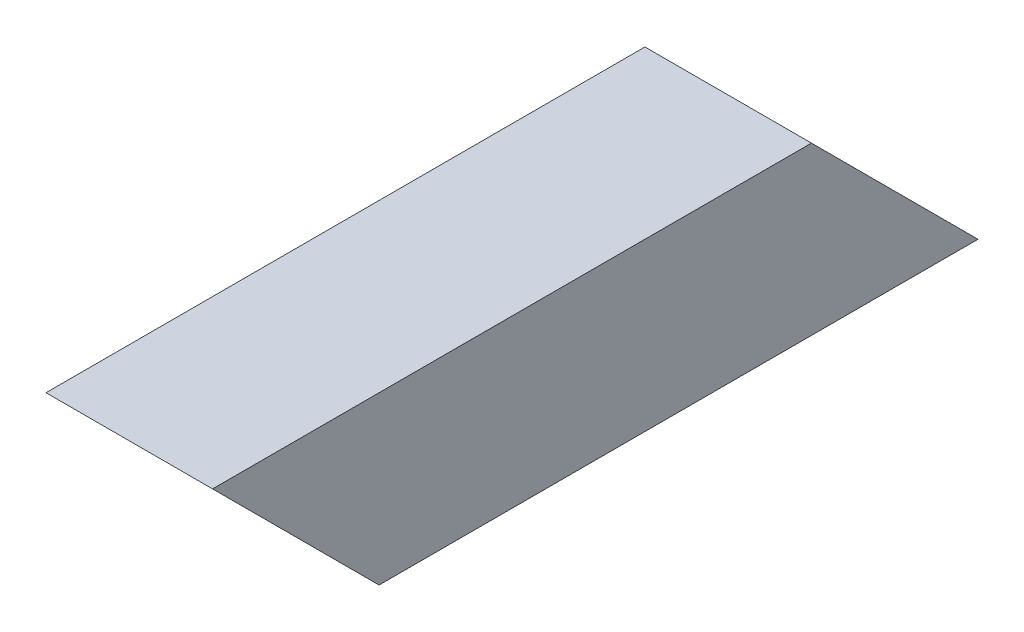
ISO-10303-21;
HEADER;
FILE_DESCRIPTION(('STEP AP214'),'2;1');
FILE_NAME('part.step','',(''),(''),'','','');
FILE_SCHEMA(('AUTOMOTIVE_DESIGN { 1 0 10303 214 1 1 1 1 }'));
ENDSEC;
DATA;
#1=APPLICATION_CONTEXT('core data for automotive mechanical design processes');
#2=APPLICATION_PROTOCOL_DEFINITION('international standard','automotive_design',2000,#1);
#3=PRODUCT_CONTEXT('',#1,'mechanical');
#4=PRODUCT('Part','Part','',(#3));
#5=PRODUCT_RELATED_PRODUCT_CATEGORY('part','',(#4));
#6=PRODUCT_DEFINITION_FORMATION('','',#4);
#7=PRODUCT_DEFINITION_CONTEXT('part definition',#1,'design');
#8=PRODUCT_DEFINITION('design','',#6,#7);
#9=PRODUCT_DEFINITION_SHAPE('','',#8);
#10=(LENGTH_UNIT() NAMED_UNIT(*) SI_UNIT(.MILLI.,.METRE.));
#11=(NAMED_UNIT(*) PLANE_ANGLE_UNIT() SI_UNIT($,.RADIAN.));
#12=(NAMED_UNIT(*) SI_UNIT($,.STERADIAN.) SOLID_ANGLE_UNIT());
#13=UNCERTAINTY_MEASURE_WITH_UNIT(LENGTH_MEASURE(1.E-05),#10,'distance_accuracy_value','');
#14=(GEOMETRIC_REPRESENTATION_CONTEXT(3) GLOBAL_UNCERTAINTY_ASSIGNED_CONTEXT((#13)) GLOBAL_UNIT_ASSIGNED_CONTEXT((#10,
#11,#12)) REPRESENTATION_CONTEXT('',''));
#15=CARTESIAN_POINT('',(0.,0.,0.));
#16=DIRECTION('',(0.,0.,1.));
#17=DIRECTION('',(1.,0.,0.));
#18=AXIS2_PLACEMENT_3D('',#15,#16,#17);
#19=CARTESIAN_POINT('',(-3.175,3.175,116.743329573834));
#20=DIRECTION('',(0.,1.,0.));
#21=DIRECTION('',(-1.,0.,0.));
#22=AXIS2_PLACEMENT_3D('',#19,#20,#21);
#23=PLANE('',#22);
#24=DIRECTION('',(-1.,0.,0.));
#25=VECTOR('',#24,1.);
#26=CARTESIAN_POINT('',(-3.175,3.175,94.5183295738334));
#27=LINE('',#26,#25);
#28=CARTESIAN_POINT('',(-3.175,3.175,94.5183295738334));
#29=VERTEX_POINT('',#28);
#30=CARTESIAN_POINT('',(-22.225,3.175,94.5183295738334));
#31=VERTEX_POINT('',#30);
#32=EDGE_CURVE('E11',#29,#31,#27,.T.);
#33=ORIENTED_EDGE('',*,*,#32,.F.);
#34=DIRECTION('',(0.,0.,-1.));
#35=VECTOR('',#34,1.);
#36=CARTESIAN_POINT('',(-3.175,3.175,116.743329573834));
#37=LINE('',#36,#35);
#38=CARTESIAN_POINT('',(-3.175,3.175,3.17500000000005));
#39=VERTEX_POINT('',#38);
#40=EDGE_CURVE('E154',#29,#39,#37,.T.);
#41=ORIENTED_EDGE('',*,*,#40,.T.);
#42=DIRECTION('',(1.,0.,0.));
#43=VECTOR('',#42,1.);
#44=CARTESIAN_POINT('',(-3.17499999999998,3.175,3.17500000000005));
#45=LINE('',#44,#43);
#46=CARTESIAN_POINT('',(-22.225,3.175,3.17500000000005));
#47=VERTEX_POINT('',#46);
#48=EDGE_CURVE('E48',#47,#39,#45,.T.);
#49=ORIENTED_EDGE('',*,*,#48,.F.);
#50=DIRECTION('',(0.,0.,-1.));
#51=VECTOR('',#50,1.);
#52=CARTESIAN_POINT('',(-22.225,3.175,116.743329573834));
#53=LINE('',#52,#51);
#54=EDGE_CURVE('E162',#31,#47,#53,.T.);
#55=ORIENTED_EDGE('',*,*,#54,.F.);
#56=EDGE_LOOP('',(#33,#41,#49,#55));
#57=FACE_BOUND('',#56,.T.);
#58=ADVANCED_FACE('F39',(#57),#23,.T.);
#59=CARTESIAN_POINT('',(-22.225,3.175,116.743329573834));
#60=DIRECTION('',(1.,0.,0.));
#61=DIRECTION('',(0.,1.,0.));
#62=AXIS2_PLACEMENT_3D('',#59,#60,#61);
#63=PLANE('',#62);
#64=DIRECTION('',(0.,0.707106781186539,0.707106781186556));
#65=VECTOR('',#64,1.);
#66=CARTESIAN_POINT('',(-22.225,14.2875000000003,105.630829573834));
#67=LINE('',#66,#65);
#68=CARTESIAN_POINT('',(-22.225,22.225,113.568329573834));
#69=VERTEX_POINT('',#68);
#70=EDGE_CURVE('E158',#31,#69,#67,.T.);
#71=ORIENTED_EDGE('',*,*,#70,.F.);
#72=ORIENTED_EDGE('',*,*,#54,.T.);
#73=DIRECTION('',(0.,-0.707106781186544,-0.707106781186551));
#74=VECTOR('',#73,1.);
#75=CARTESIAN_POINT('',(-22.225,59.959164786917,59.9591647869176));
#76=LINE('',#75,#74);
#77=CARTESIAN_POINT('',(-22.225,22.225,22.2250000000002));
#78=VERTEX_POINT('',#77);
#79=EDGE_CURVE('E145',#78,#47,#76,.T.);
#80=ORIENTED_EDGE('',*,*,#79,.F.);
#81=DIRECTION('',(0.,0.,-1.));
#82=VECTOR('',#81,1.);
#83=CARTESIAN_POINT('',(-22.225,22.225,116.743329573834));
#84=LINE('',#83,#82);
#85=EDGE_CURVE('E166',#69,#78,#84,.T.);
#86=ORIENTED_EDGE('',*,*,#85,.F.);
#87=EDGE_LOOP('',(#71,#72,#80,#86));
#88=FACE_BOUND('',#87,.T.);
#89=ADVANCED_FACE('F209',(#88),#63,.T.);
#90=CARTESIAN_POINT('',(-3.175,22.225,116.743329573834));
#91=DIRECTION('',(0.,-1.,0.));
#92=DIRECTION('',(1.,0.,0.));
#93=AXIS2_PLACEMENT_3D('',#90,#91,#92);
#94=PLANE('',#93);
#95=DIRECTION('',(1.,0.,0.));
#96=VECTOR('',#95,1.);
#97=CARTESIAN_POINT('',(-3.175,22.225,113.568329573834));
#98=LINE('',#97,#96);
#99=CARTESIAN_POINT('',(-3.175,22.225,113.568329573834));
#100=VERTEX_POINT('',#99);
#101=EDGE_CURVE('E168',#69,#100,#98,.T.);
#102=ORIENTED_EDGE('',*,*,#101,.F.);
#103=ORIENTED_EDGE('',*,*,#85,.T.);
#104=DIRECTION('',(-1.,0.,0.));
#105=VECTOR('',#104,1.);
#106=CARTESIAN_POINT('',(-3.17499999999998,22.225,22.2250000000002));
#107=LINE('',#106,#105);
#108=CARTESIAN_POINT('',(-3.175,22.225,22.2250000000002));
#109=VERTEX_POINT('',#108);
#110=EDGE_CURVE('E159',#109,#78,#107,.T.);
#111=ORIENTED_EDGE('',*,*,#110,.F.);
#112=DIRECTION('',(0.,0.,-1.));
#113=VECTOR('',#112,1.);
#114=CARTESIAN_POINT('',(-3.175,22.225,116.743329573834));
#115=LINE('',#114,#113);
#116=EDGE_CURVE('E156',#100,#109,#115,.T.);
#117=ORIENTED_EDGE('',*,*,#116,.F.);
#118=EDGE_LOOP('',(#102,#103,#111,#117));
#119=FACE_BOUND('',#118,.T.);
#120=ADVANCED_FACE('F207',(#119),#94,.T.);
#121=CARTESIAN_POINT('',(-3.175,3.175,116.743329573834));
#122=DIRECTION('',(-1.,0.,0.));
#123=DIRECTION('',(0.,-1.,0.));
#124=AXIS2_PLACEMENT_3D('',#121,#122,#123);
#125=PLANE('',#124);
#126=DIRECTION('',(0.,-0.707106781186539,-0.707106781186556));
#127=VECTOR('',#126,1.);
#128=CARTESIAN_POINT('',(-3.175,14.2875000000003,105.630829573834));
#129=LINE('',#128,#127);
#130=EDGE_CURVE('E62',#100,#29,#129,.T.);
#131=ORIENTED_EDGE('',*,*,#130,.F.);
#132=ORIENTED_EDGE('',*,*,#116,.T.);
#133=DIRECTION('',(0.,0.707106781186544,0.707106781186551));
#134=VECTOR('',#133,1.);
#135=CARTESIAN_POINT('',(-3.175,59.959164786917,59.9591647869176));
#136=LINE('',#135,#134);
#137=EDGE_CURVE('E142',#39,#109,#136,.T.);
#138=ORIENTED_EDGE('',*,*,#137,.F.);
#139=ORIENTED_EDGE('',*,*,#40,.F.);
#140=EDGE_LOOP('',(#131,#132,#138,#139));
#141=FACE_BOUND('',#140,.T.);
#142=ADVANCED_FACE('F153',(#141),#125,.T.);
#143=CARTESIAN_POINT('',(-25.4,0.,0.));
#144=DIRECTION('',(0.,-0.707106781186551,0.707106781186544));
#145=DIRECTION('',(0.,-0.707106781186544,-0.707106781186551));
#146=AXIS2_PLACEMENT_3D('',#143,#144,#145);
#147=PLANE('',#146);
#148=ORIENTED_EDGE('',*,*,#137,.T.);
#149=ORIENTED_EDGE('',*,*,#110,.T.);
#150=ORIENTED_EDGE('',*,*,#79,.T.);
#151=ORIENTED_EDGE('',*,*,#48,.T.);
#152=EDGE_LOOP('',(#148,#149,#150,#151));
#153=FACE_BOUND('',#152,.T.);
#154=DIRECTION('',(0.,-0.707106781186544,-0.707106781186551));
#155=VECTOR('',#154,1.);
#156=CARTESIAN_POINT('',(0.,0.,0.));
#157=LINE('',#156,#155);
#158=CARTESIAN_POINT('',(0.,25.4,25.4000000000003));
#159=VERTEX_POINT('',#158);
#160=CARTESIAN_POINT('',(0.,0.,0.));
#161=VERTEX_POINT('',#160);
#162=EDGE_CURVE('E184',#159,#161,#157,.T.);
#163=ORIENTED_EDGE('',*,*,#162,.T.);
#164=DIRECTION('',(1.,0.,0.));
#165=VECTOR('',#164,1.);
#166=CARTESIAN_POINT('',(0.,0.,0.));
#167=LINE('',#166,#165);
#168=CARTESIAN_POINT('',(-25.4,0.,0.));
#169=VERTEX_POINT('',#168);
#170=EDGE_CURVE('E112',#169,#161,#167,.T.);
#171=ORIENTED_EDGE('',*,*,#170,.F.);
#172=DIRECTION('',(0.,-0.707106781186544,-0.707106781186551));
#173=VECTOR('',#172,1.);
#174=CARTESIAN_POINT('',(-25.4,0.,0.));
#175=LINE('',#174,#173);
#176=CARTESIAN_POINT('',(-25.4,25.4,25.4000000000003));
#177=VERTEX_POINT('',#176);
#178=EDGE_CURVE('E187',#177,#169,#175,.T.);
#179=ORIENTED_EDGE('',*,*,#178,.F.);
#180=DIRECTION('',(1.,0.,0.));
#181=VECTOR('',#180,1.);
#182=CARTESIAN_POINT('',(-25.4,25.4,25.4000000000003));
#183=LINE('',#182,#181);
#184=EDGE_CURVE('E127',#177,#159,#183,.T.);
#185=ORIENTED_EDGE('',*,*,#184,.T.);
#186=EDGE_LOOP('',(#163,#171,#179,#185));
#187=FACE_BOUND('',#186,.T.);
#188=ADVANCED_FACE('F140',(#153,#187),#147,.F.);
#189=CARTESIAN_POINT('',(-25.4,25.4,116.743329573834));
#190=DIRECTION('',(0.,0.707106781186556,-0.707106781186539));
#191=DIRECTION('',(0.,0.707106781186539,0.707106781186556));
#192=AXIS2_PLACEMENT_3D('',#189,#190,#191);
#193=PLANE('',#192);
#194=ORIENTED_EDGE('',*,*,#130,.T.);
#195=ORIENTED_EDGE('',*,*,#32,.T.);
#196=ORIENTED_EDGE('',*,*,#70,.T.);
#197=ORIENTED_EDGE('',*,*,#101,.T.);
#198=EDGE_LOOP('',(#194,#195,#196,#197));
#199=FACE_BOUND('',#198,.T.);
#200=DIRECTION('',(0.,0.707106781186539,0.707106781186556));
#201=VECTOR('',#200,1.);
#202=CARTESIAN_POINT('',(0.,25.4,116.743329573834));
#203=LINE('',#202,#201);
#204=CARTESIAN_POINT('',(0.,0.,91.3433295738334));
#205=VERTEX_POINT('',#204);
#206=CARTESIAN_POINT('',(0.,25.4,116.743329573834));
#207=VERTEX_POINT('',#206);
#208=EDGE_CURVE('E105',#205,#207,#203,.T.);
#209=ORIENTED_EDGE('',*,*,#208,.T.);
#210=DIRECTION('',(-1.,0.,0.));
#211=VECTOR('',#210,1.);
#212=CARTESIAN_POINT('',(0.,25.4,116.743329573834));
#213=LINE('',#212,#211);
#214=CARTESIAN_POINT('',(-25.4,25.4,116.743329573834));
#215=VERTEX_POINT('',#214);
#216=EDGE_CURVE('E102',#207,#215,#213,.T.);
#217=ORIENTED_EDGE('',*,*,#216,.T.);
#218=DIRECTION('',(0.,0.707106781186539,0.707106781186556));
#219=VECTOR('',#218,1.);
#220=CARTESIAN_POINT('',(-25.4,25.4,116.743329573834));
#221=LINE('',#220,#219);
#222=CARTESIAN_POINT('',(-25.4,0.,91.3433295738334));
#223=VERTEX_POINT('',#222);
#224=EDGE_CURVE('E55',#223,#215,#221,.T.);
#225=ORIENTED_EDGE('',*,*,#224,.F.);
#226=DIRECTION('',(1.,0.,0.));
#227=VECTOR('',#226,1.);
#228=CARTESIAN_POINT('',(-25.4,0.,91.3433295738334));
#229=LINE('',#228,#227);
#230=EDGE_CURVE('E123',#223,#205,#229,.T.);
#231=ORIENTED_EDGE('',*,*,#230,.T.);
#232=EDGE_LOOP('',(#209,#217,#225,#231));
#233=FACE_BOUND('',#232,.T.);
#234=ADVANCED_FACE('F103',(#199,#233),#193,.F.);
#235=CARTESIAN_POINT('',(0.,0.,116.743329573834));
#236=DIRECTION('',(-1.,0.,0.));
#237=DIRECTION('',(0.,-1.,0.));
#238=AXIS2_PLACEMENT_3D('',#235,#236,#237);
#239=PLANE('',#238);
#240=DIRECTION('',(0.,0.,-1.));
#241=VECTOR('',#240,1.);
#242=CARTESIAN_POINT('',(0.,25.4,116.743329573834));
#243=LINE('',#242,#241);
#244=EDGE_CURVE('E129',#207,#159,#243,.T.);
#245=ORIENTED_EDGE('',*,*,#244,.F.);
#246=ORIENTED_EDGE('',*,*,#208,.F.);
#247=DIRECTION('',(0.,0.,-1.));
#248=VECTOR('',#247,1.);
#249=CARTESIAN_POINT('',(0.,0.,116.743329573834));
#250=LINE('',#249,#248);
#251=EDGE_CURVE('E111',#205,#161,#250,.T.);
#252=ORIENTED_EDGE('',*,*,#251,.T.);
#253=ORIENTED_EDGE('',*,*,#162,.F.);
#254=EDGE_LOOP('',(#245,#246,#252,#253));
#255=FACE_BOUND('',#254,.T.);
#256=ADVANCED_FACE('F41',(#255),#239,.F.);
#257=CARTESIAN_POINT('',(0.,25.4,116.743329573834));
#258=DIRECTION('',(0.,-1.,0.));
#259=DIRECTION('',(1.,0.,0.));
#260=AXIS2_PLACEMENT_3D('',#257,#258,#259);
#261=PLANE('',#260);
#262=ORIENTED_EDGE('',*,*,#244,.T.);
#263=ORIENTED_EDGE('',*,*,#184,.F.);
#264=DIRECTION('',(0.,0.,-1.));
#265=VECTOR('',#264,1.);
#266=CARTESIAN_POINT('',(-25.4,25.4,116.743329573834));
#267=LINE('',#266,#265);
#268=EDGE_CURVE('E119',#215,#177,#267,.T.);
#269=ORIENTED_EDGE('',*,*,#268,.F.);
#270=ORIENTED_EDGE('',*,*,#216,.F.);
#271=EDGE_LOOP('',(#262,#263,#269,#270));
#272=FACE_BOUND('',#271,.T.);
#273=ADVANCED_FACE('F126',(#272),#261,.F.);
#274=CARTESIAN_POINT('',(-25.4,0.,116.743329573834));
#275=DIRECTION('',(1.,0.,0.));
#276=DIRECTION('',(0.,0.,-1.));
#277=AXIS2_PLACEMENT_3D('',#274,#275,#276);
#278=PLANE('',#277);
#279=DIRECTION('',(0.,0.,-1.));
#280=VECTOR('',#279,1.);
#281=CARTESIAN_POINT('',(-25.4,0.,116.743329573834));
#282=LINE('',#281,#280);
#283=EDGE_CURVE('E121',#223,#169,#282,.T.);
#284=ORIENTED_EDGE('',*,*,#283,.F.);
#285=ORIENTED_EDGE('',*,*,#224,.T.);
#286=ORIENTED_EDGE('',*,*,#268,.T.);
#287=ORIENTED_EDGE('',*,*,#178,.T.);
#288=EDGE_LOOP('',(#284,#285,#286,#287));
#289=FACE_BOUND('',#288,.T.);
#290=ADVANCED_FACE('F117',(#289),#278,.F.);
#291=CARTESIAN_POINT('',(0.,0.,116.743329573834));
#292=DIRECTION('',(0.,1.,0.));
#293=DIRECTION('',(-1.,0.,0.));
#294=AXIS2_PLACEMENT_3D('',#291,#292,#293);
#295=PLANE('',#294);
#296=ORIENTED_EDGE('',*,*,#251,.F.);
#297=ORIENTED_EDGE('',*,*,#230,.F.);
#298=ORIENTED_EDGE('',*,*,#283,.T.);
#299=ORIENTED_EDGE('',*,*,#170,.T.);
#300=EDGE_LOOP('',(#296,#297,#298,#299));
#301=FACE_BOUND('',#300,.T.);
#302=ADVANCED_FACE('F186',(#301),#295,.F.);
#303=CLOSED_SHELL('',(#58,#89,#120,#142,#188,#234,#256,#273,#290,#302));
#304=MANIFOLD_SOLID_BREP('B2',#303);
#305=ADVANCED_BREP_SHAPE_REPRESENTATION('',(#18,#304),#14);
#306=SHAPE_DEFINITION_REPRESENTATION(#9,#305);
ENDSEC;
END-ISO-10303-21;
